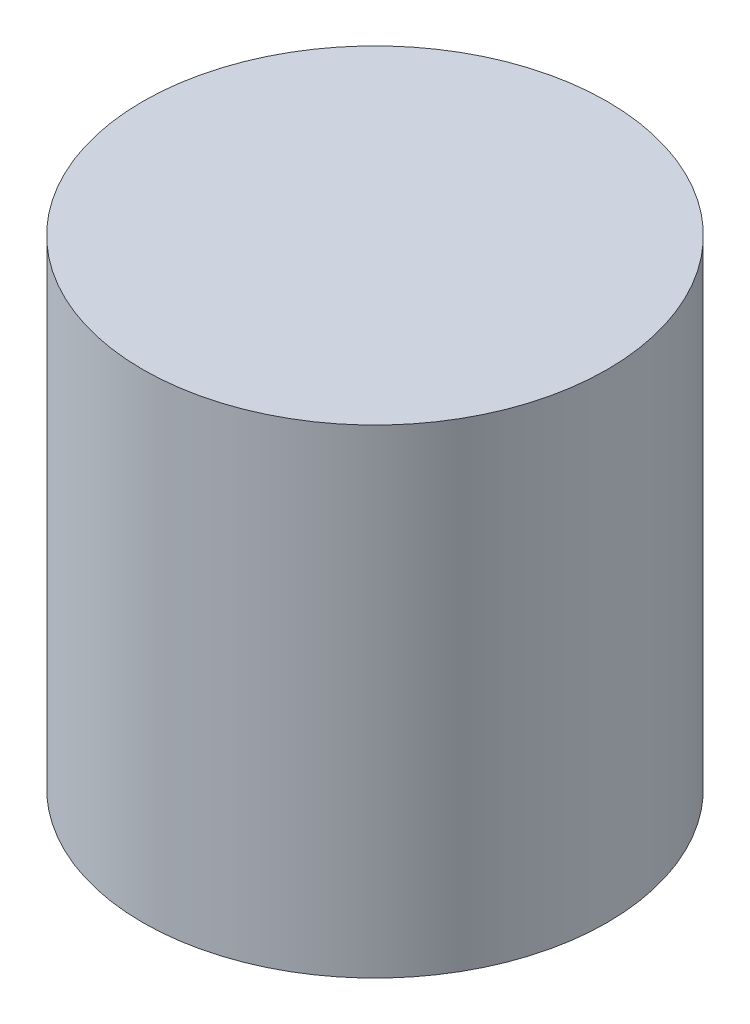
ISO-10303-21;
HEADER;
FILE_DESCRIPTION(('STEP AP214'),'2;1');
FILE_NAME('part.step','',(''),(''),'','','');
FILE_SCHEMA(('AUTOMOTIVE_DESIGN { 1 0 10303 214 1 1 1 1 }'));
ENDSEC;
DATA;
#1=APPLICATION_CONTEXT('core data for automotive mechanical design processes');
#2=APPLICATION_PROTOCOL_DEFINITION('international standard','automotive_design',2000,#1);
#3=PRODUCT_CONTEXT('',#1,'mechanical');
#4=PRODUCT('Part','Part','',(#3));
#5=PRODUCT_RELATED_PRODUCT_CATEGORY('part','',(#4));
#6=PRODUCT_DEFINITION_FORMATION('','',#4);
#7=PRODUCT_DEFINITION_CONTEXT('part definition',#1,'design');
#8=PRODUCT_DEFINITION('design','',#6,#7);
#9=PRODUCT_DEFINITION_SHAPE('','',#8);
#10=(LENGTH_UNIT() NAMED_UNIT(*) SI_UNIT(.MILLI.,.METRE.));
#11=(NAMED_UNIT(*) PLANE_ANGLE_UNIT() SI_UNIT($,.RADIAN.));
#12=(NAMED_UNIT(*) SI_UNIT($,.STERADIAN.) SOLID_ANGLE_UNIT());
#13=UNCERTAINTY_MEASURE_WITH_UNIT(LENGTH_MEASURE(1.E-05),#10,'distance_accuracy_value','');
#14=(GEOMETRIC_REPRESENTATION_CONTEXT(3) GLOBAL_UNCERTAINTY_ASSIGNED_CONTEXT((#13)) GLOBAL_UNIT_ASSIGNED_CONTEXT((#10,
#11,#12)) REPRESENTATION_CONTEXT('',''));
#15=CARTESIAN_POINT('',(0.,0.,0.));
#16=DIRECTION('',(0.,0.,1.));
#17=DIRECTION('',(1.,0.,0.));
#18=AXIS2_PLACEMENT_3D('',#15,#16,#17);
#19=CARTESIAN_POINT('',(0.,66.,0.));
#20=DIRECTION('',(0.,-1.,0.));
#21=DIRECTION('',(0.,0.,-1.));
#22=AXIS2_PLACEMENT_3D('',#19,#20,#21);
#23=CYLINDRICAL_SURFACE('',#22,32.);
#24=CARTESIAN_POINT('',(0.,66.,0.));
#25=DIRECTION('',(0.,1.,0.));
#26=DIRECTION('',(0.,0.,1.));
#27=AXIS2_PLACEMENT_3D('',#24,#25,#26);
#28=CIRCLE('',#27,32.);
#29=CARTESIAN_POINT('',(0.,66.,32.));
#30=VERTEX_POINT('',#29);
#31=EDGE_CURVE('E10',#30,#30,#28,.T.);
#32=ORIENTED_EDGE('',*,*,#31,.F.);
#33=EDGE_LOOP('',(#32));
#34=FACE_BOUND('',#33,.T.);
#35=CARTESIAN_POINT('',(0.,0.,0.));
#36=DIRECTION('',(0.,1.,0.));
#37=DIRECTION('',(0.,0.,1.));
#38=AXIS2_PLACEMENT_3D('',#35,#36,#37);
#39=CIRCLE('',#38,32.);
#40=CARTESIAN_POINT('',(0.,0.,32.));
#41=VERTEX_POINT('',#40);
#42=EDGE_CURVE('E40',#41,#41,#39,.T.);
#43=ORIENTED_EDGE('',*,*,#42,.T.);
#44=EDGE_LOOP('',(#43));
#45=FACE_BOUND('',#44,.T.);
#46=ADVANCED_FACE('F37',(#34,#45),#23,.T.);
#47=CARTESIAN_POINT('',(0.,66.,0.));
#48=DIRECTION('',(0.,1.,0.));
#49=DIRECTION('',(0.,0.,1.));
#50=AXIS2_PLACEMENT_3D('',#47,#48,#49);
#51=PLANE('',#50);
#52=ORIENTED_EDGE('',*,*,#31,.T.);
#53=EDGE_LOOP('',(#52));
#54=FACE_BOUND('',#53,.T.);
#55=ADVANCED_FACE('F52',(#54),#51,.T.);
#56=CARTESIAN_POINT('',(0.,0.,0.));
#57=DIRECTION('',(0.,1.,0.));
#58=DIRECTION('',(0.,0.,1.));
#59=AXIS2_PLACEMENT_3D('',#56,#57,#58);
#60=PLANE('',#59);
#61=ORIENTED_EDGE('',*,*,#42,.F.);
#62=EDGE_LOOP('',(#61));
#63=FACE_BOUND('',#62,.T.);
#64=ADVANCED_FACE('F50',(#63),#60,.F.);
#65=CLOSED_SHELL('',(#46,#55,#64));
#66=MANIFOLD_SOLID_BREP('B2',#65);
#67=ADVANCED_BREP_SHAPE_REPRESENTATION('',(#18,#66),#14);
#68=SHAPE_DEFINITION_REPRESENTATION(#9,#67);
ENDSEC;
END-ISO-10303-21;
